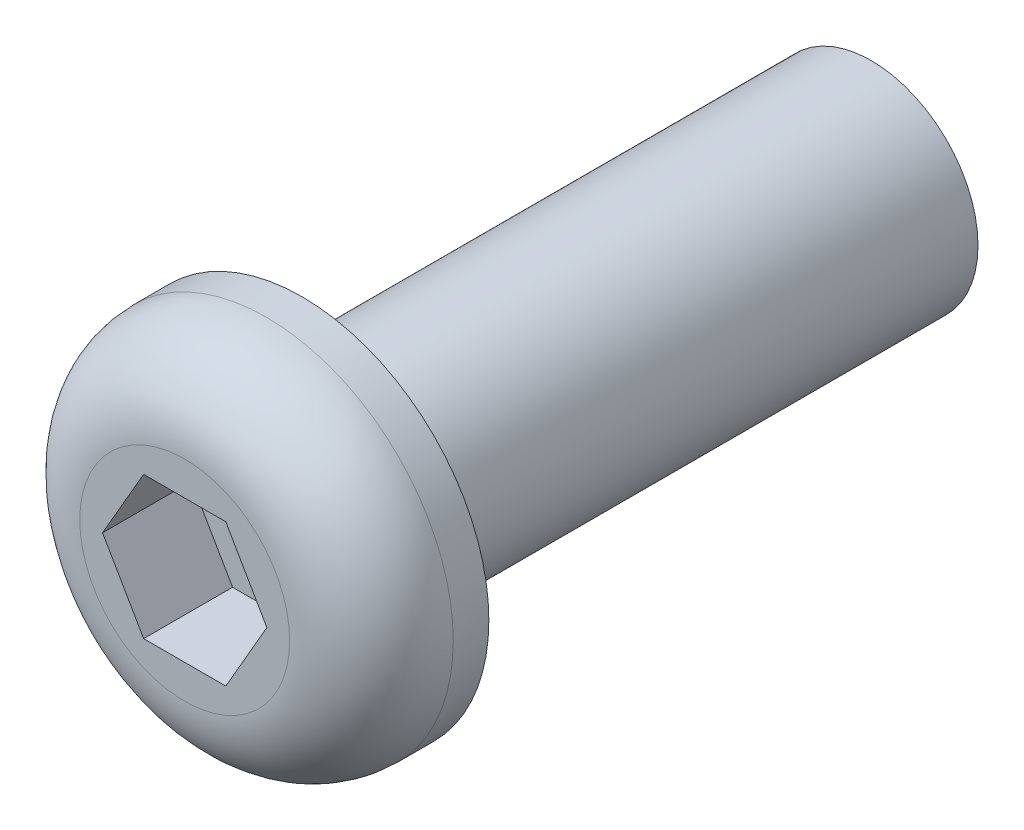
ISO-10303-21;
HEADER;
FILE_DESCRIPTION(('STEP AP214'),'2;1');
FILE_NAME('part.step','',(''),(''),'','','');
FILE_SCHEMA(('AUTOMOTIVE_DESIGN { 1 0 10303 214 1 1 1 1 }'));
ENDSEC;
DATA;
#1=APPLICATION_CONTEXT('core data for automotive mechanical design processes');
#2=APPLICATION_PROTOCOL_DEFINITION('international standard','automotive_design',2000,#1);
#3=PRODUCT_CONTEXT('',#1,'mechanical');
#4=PRODUCT('Part','Part','',(#3));
#5=PRODUCT_RELATED_PRODUCT_CATEGORY('part','',(#4));
#6=PRODUCT_DEFINITION_FORMATION('','',#4);
#7=PRODUCT_DEFINITION_CONTEXT('part definition',#1,'design');
#8=PRODUCT_DEFINITION('design','',#6,#7);
#9=PRODUCT_DEFINITION_SHAPE('','',#8);
#10=(LENGTH_UNIT() NAMED_UNIT(*) SI_UNIT(.MILLI.,.METRE.));
#11=(NAMED_UNIT(*) PLANE_ANGLE_UNIT() SI_UNIT($,.RADIAN.));
#12=(NAMED_UNIT(*) SI_UNIT($,.STERADIAN.) SOLID_ANGLE_UNIT());
#13=UNCERTAINTY_MEASURE_WITH_UNIT(LENGTH_MEASURE(1.E-05),#10,'distance_accuracy_value','');
#14=(GEOMETRIC_REPRESENTATION_CONTEXT(3) GLOBAL_UNCERTAINTY_ASSIGNED_CONTEXT((#13)) GLOBAL_UNIT_ASSIGNED_CONTEXT((#10,
#11,#12)) REPRESENTATION_CONTEXT('',''));
#15=CARTESIAN_POINT('',(0.,0.,0.));
#16=DIRECTION('',(0.,0.,1.));
#17=DIRECTION('',(1.,0.,0.));
#18=AXIS2_PLACEMENT_3D('',#15,#16,#17);
#19=CARTESIAN_POINT('',(0.,0.,-16.));
#20=DIRECTION('',(0.,0.,1.));
#21=DIRECTION('',(1.,0.,0.));
#22=AXIS2_PLACEMENT_3D('',#19,#20,#21);
#23=CYLINDRICAL_SURFACE('',#22,3.);
#24=CARTESIAN_POINT('',(0.,0.,-16.));
#25=DIRECTION('',(0.,0.,1.));
#26=DIRECTION('',(1.,0.,0.));
#27=AXIS2_PLACEMENT_3D('',#24,#25,#26);
#28=CIRCLE('',#27,3.);
#29=CARTESIAN_POINT('',(3.,0.,-16.));
#30=VERTEX_POINT('',#29);
#31=EDGE_CURVE('E11',#30,#30,#28,.T.);
#32=ORIENTED_EDGE('',*,*,#31,.T.);
#33=EDGE_LOOP('',(#32));
#34=FACE_BOUND('',#33,.T.);
#35=CARTESIAN_POINT('',(0.,0.,0.));
#36=DIRECTION('',(0.,0.,1.));
#37=DIRECTION('',(1.,0.,0.));
#38=AXIS2_PLACEMENT_3D('',#35,#36,#37);
#39=CIRCLE('',#38,3.);
#40=CARTESIAN_POINT('',(3.,0.,0.));
#41=VERTEX_POINT('',#40);
#42=EDGE_CURVE('E37',#41,#41,#39,.T.);
#43=ORIENTED_EDGE('',*,*,#42,.F.);
#44=EDGE_LOOP('',(#43));
#45=FACE_BOUND('',#44,.T.);
#46=ADVANCED_FACE('F34',(#34,#45),#23,.T.);
#47=CARTESIAN_POINT('',(0.,0.,-16.));
#48=DIRECTION('',(0.,0.,1.));
#49=DIRECTION('',(1.,0.,0.));
#50=AXIS2_PLACEMENT_3D('',#47,#48,#49);
#51=PLANE('',#50);
#52=ORIENTED_EDGE('',*,*,#31,.F.);
#53=EDGE_LOOP('',(#52));
#54=FACE_BOUND('',#53,.T.);
#55=ADVANCED_FACE('F157',(#54),#51,.F.);
#56=CARTESIAN_POINT('',(0.,0.,3.3));
#57=DIRECTION('',(0.,0.,1.));
#58=DIRECTION('',(1.,0.,0.));
#59=AXIS2_PLACEMENT_3D('',#56,#57,#58);
#60=PLANE('',#59);
#61=DIRECTION('',(-1.,0.,0.));
#62=VECTOR('',#61,1.);
#63=CARTESIAN_POINT('',(1.15470053837925,2.,3.3));
#64=LINE('',#63,#62);
#65=CARTESIAN_POINT('',(1.15470053837925,2.,3.3));
#66=VERTEX_POINT('',#65);
#67=CARTESIAN_POINT('',(-1.15470053837925,2.,3.3));
#68=VERTEX_POINT('',#67);
#69=EDGE_CURVE('E48',#66,#68,#64,.T.);
#70=ORIENTED_EDGE('',*,*,#69,.F.);
#71=DIRECTION('',(-0.5,0.866025403784439,0.));
#72=VECTOR('',#71,1.);
#73=CARTESIAN_POINT('',(2.3094010767585,0.,3.3));
#74=LINE('',#73,#72);
#75=CARTESIAN_POINT('',(2.3094010767585,0.,3.3));
#76=VERTEX_POINT('',#75);
#77=EDGE_CURVE('E131',#76,#66,#74,.T.);
#78=ORIENTED_EDGE('',*,*,#77,.F.);
#79=DIRECTION('',(0.5,0.866025403784439,0.));
#80=VECTOR('',#79,1.);
#81=CARTESIAN_POINT('',(1.15470053837925,-2.,3.3));
#82=LINE('',#81,#80);
#83=CARTESIAN_POINT('',(1.15470053837925,-2.,3.3));
#84=VERTEX_POINT('',#83);
#85=EDGE_CURVE('E129',#84,#76,#82,.T.);
#86=ORIENTED_EDGE('',*,*,#85,.F.);
#87=DIRECTION('',(1.,0.,0.));
#88=VECTOR('',#87,1.);
#89=CARTESIAN_POINT('',(-1.15470053837925,-2.,3.3));
#90=LINE('',#89,#88);
#91=CARTESIAN_POINT('',(-1.15470053837925,-2.,3.3));
#92=VERTEX_POINT('',#91);
#93=EDGE_CURVE('E96',#92,#84,#90,.T.);
#94=ORIENTED_EDGE('',*,*,#93,.F.);
#95=DIRECTION('',(0.5,-0.866025403784439,0.));
#96=VECTOR('',#95,1.);
#97=CARTESIAN_POINT('',(-2.3094010767585,0.,3.3));
#98=LINE('',#97,#96);
#99=CARTESIAN_POINT('',(-2.3094010767585,0.,3.3));
#100=VERTEX_POINT('',#99);
#101=EDGE_CURVE('E125',#100,#92,#98,.T.);
#102=ORIENTED_EDGE('',*,*,#101,.F.);
#103=DIRECTION('',(-0.5,-0.866025403784438,0.));
#104=VECTOR('',#103,1.);
#105=CARTESIAN_POINT('',(-1.15470053837925,2.,3.3));
#106=LINE('',#105,#104);
#107=EDGE_CURVE('E122',#68,#100,#106,.T.);
#108=ORIENTED_EDGE('',*,*,#107,.F.);
#109=EDGE_LOOP('',(#70,#78,#86,#94,#102,#108));
#110=FACE_BOUND('',#109,.T.);
#111=CARTESIAN_POINT('',(0.,0.,3.3));
#112=DIRECTION('',(0.,0.,-1.));
#113=DIRECTION('',(-1.,0.,0.));
#114=AXIS2_PLACEMENT_3D('',#111,#112,#113);
#115=CIRCLE('',#114,2.95);
#116=CARTESIAN_POINT('',(-2.95,0.,3.3));
#117=VERTEX_POINT('',#116);
#118=EDGE_CURVE('E146',#117,#117,#115,.T.);
#119=ORIENTED_EDGE('',*,*,#118,.F.);
#120=EDGE_LOOP('',(#119));
#121=FACE_BOUND('',#120,.T.);
#122=ADVANCED_FACE('F162',(#110,#121),#60,.T.);
#123=CARTESIAN_POINT('',(0.,0.,1.));
#124=DIRECTION('',(0.,0.,-1.));
#125=DIRECTION('',(-1.,0.,0.));
#126=AXIS2_PLACEMENT_3D('',#123,#124,#125);
#127=TOROIDAL_SURFACE('',#126,2.95,2.3);
#128=ORIENTED_EDGE('',*,*,#118,.T.);
#129=EDGE_LOOP('',(#128));
#130=FACE_BOUND('',#129,.T.);
#131=CARTESIAN_POINT('',(0.,0.,1.));
#132=DIRECTION('',(0.,0.,-1.));
#133=DIRECTION('',(-1.,0.,0.));
#134=AXIS2_PLACEMENT_3D('',#131,#132,#133);
#135=CIRCLE('',#134,5.25);
#136=CARTESIAN_POINT('',(-5.25,0.,1.));
#137=VERTEX_POINT('',#136);
#138=EDGE_CURVE('E143',#137,#137,#135,.T.);
#139=ORIENTED_EDGE('',*,*,#138,.F.);
#140=EDGE_LOOP('',(#139));
#141=FACE_BOUND('',#140,.T.);
#142=ADVANCED_FACE('F168',(#130,#141),#127,.T.);
#143=CARTESIAN_POINT('',(0.,0.,0.));
#144=DIRECTION('',(0.,0.,-1.));
#145=DIRECTION('',(-1.,0.,0.));
#146=AXIS2_PLACEMENT_3D('',#143,#144,#145);
#147=CYLINDRICAL_SURFACE('',#146,5.25);
#148=ORIENTED_EDGE('',*,*,#138,.T.);
#149=EDGE_LOOP('',(#148));
#150=FACE_BOUND('',#149,.T.);
#151=CARTESIAN_POINT('',(0.,0.,0.));
#152=DIRECTION('',(0.,0.,-1.));
#153=DIRECTION('',(-1.,0.,0.));
#154=AXIS2_PLACEMENT_3D('',#151,#152,#153);
#155=CIRCLE('',#154,5.25);
#156=CARTESIAN_POINT('',(-5.25,0.,0.));
#157=VERTEX_POINT('',#156);
#158=EDGE_CURVE('E135',#157,#157,#155,.T.);
#159=ORIENTED_EDGE('',*,*,#158,.F.);
#160=EDGE_LOOP('',(#159));
#161=FACE_BOUND('',#160,.T.);
#162=ADVANCED_FACE('F174',(#150,#161),#147,.T.);
#163=CARTESIAN_POINT('',(0.,0.,0.));
#164=DIRECTION('',(0.,0.,-1.));
#165=DIRECTION('',(-1.,0.,0.));
#166=AXIS2_PLACEMENT_3D('',#163,#164,#165);
#167=PLANE('',#166);
#168=ORIENTED_EDGE('',*,*,#42,.T.);
#169=EDGE_LOOP('',(#168));
#170=FACE_BOUND('',#169,.T.);
#171=ORIENTED_EDGE('',*,*,#158,.T.);
#172=EDGE_LOOP('',(#171));
#173=FACE_BOUND('',#172,.T.);
#174=ADVANCED_FACE('F153',(#170,#173),#167,.T.);
#175=CARTESIAN_POINT('',(1.15470053837925,2.,0.8));
#176=DIRECTION('',(0.,1.,0.));
#177=DIRECTION('',(0.,0.,1.));
#178=AXIS2_PLACEMENT_3D('',#175,#176,#177);
#179=PLANE('',#178);
#180=ORIENTED_EDGE('',*,*,#69,.T.);
#181=DIRECTION('',(0.,0.,1.));
#182=VECTOR('',#181,1.);
#183=CARTESIAN_POINT('',(-1.15470053837925,2.,0.8));
#184=LINE('',#183,#182);
#185=CARTESIAN_POINT('',(-1.15470053837925,2.,0.8));
#186=VERTEX_POINT('',#185);
#187=EDGE_CURVE('E78',#186,#68,#184,.T.);
#188=ORIENTED_EDGE('',*,*,#187,.F.);
#189=DIRECTION('',(-1.,0.,0.));
#190=VECTOR('',#189,1.);
#191=CARTESIAN_POINT('',(1.15470053837925,2.,0.8));
#192=LINE('',#191,#190);
#193=CARTESIAN_POINT('',(1.15470053837925,2.,0.8));
#194=VERTEX_POINT('',#193);
#195=EDGE_CURVE('E133',#194,#186,#192,.T.);
#196=ORIENTED_EDGE('',*,*,#195,.F.);
#197=DIRECTION('',(0.,0.,1.));
#198=VECTOR('',#197,1.);
#199=CARTESIAN_POINT('',(1.15470053837925,2.,0.8));
#200=LINE('',#199,#198);
#201=EDGE_CURVE('E56',#194,#66,#200,.T.);
#202=ORIENTED_EDGE('',*,*,#201,.T.);
#203=EDGE_LOOP('',(#180,#188,#196,#202));
#204=FACE_BOUND('',#203,.T.);
#205=ADVANCED_FACE('F180',(#204),#179,.F.);
#206=CARTESIAN_POINT('',(2.3094010767585,0.,0.8));
#207=DIRECTION('',(0.866025403784439,0.5,0.));
#208=DIRECTION('',(-0.5,0.866025403784439,0.));
#209=AXIS2_PLACEMENT_3D('',#206,#207,#208);
#210=PLANE('',#209);
#211=ORIENTED_EDGE('',*,*,#77,.T.);
#212=ORIENTED_EDGE('',*,*,#201,.F.);
#213=DIRECTION('',(-0.5,0.866025403784439,0.));
#214=VECTOR('',#213,1.);
#215=CARTESIAN_POINT('',(2.3094010767585,0.,0.8));
#216=LINE('',#215,#214);
#217=CARTESIAN_POINT('',(2.3094010767585,0.,0.8));
#218=VERTEX_POINT('',#217);
#219=EDGE_CURVE('E108',#218,#194,#216,.T.);
#220=ORIENTED_EDGE('',*,*,#219,.F.);
#221=DIRECTION('',(0.,0.,1.));
#222=VECTOR('',#221,1.);
#223=CARTESIAN_POINT('',(2.3094010767585,0.,0.8));
#224=LINE('',#223,#222);
#225=EDGE_CURVE('E100',#218,#76,#224,.T.);
#226=ORIENTED_EDGE('',*,*,#225,.T.);
#227=EDGE_LOOP('',(#211,#212,#220,#226));
#228=FACE_BOUND('',#227,.T.);
#229=ADVANCED_FACE('F183',(#228),#210,.F.);
#230=CARTESIAN_POINT('',(1.15470053837925,-2.,0.8));
#231=DIRECTION('',(0.866025403784439,-0.5,0.));
#232=DIRECTION('',(0.5,0.866025403784439,0.));
#233=AXIS2_PLACEMENT_3D('',#230,#231,#232);
#234=PLANE('',#233);
#235=ORIENTED_EDGE('',*,*,#85,.T.);
#236=ORIENTED_EDGE('',*,*,#225,.F.);
#237=DIRECTION('',(0.5,0.866025403784439,0.));
#238=VECTOR('',#237,1.);
#239=CARTESIAN_POINT('',(1.15470053837925,-2.,0.8));
#240=LINE('',#239,#238);
#241=CARTESIAN_POINT('',(1.15470053837925,-2.,0.8));
#242=VERTEX_POINT('',#241);
#243=EDGE_CURVE('E104',#242,#218,#240,.T.);
#244=ORIENTED_EDGE('',*,*,#243,.F.);
#245=DIRECTION('',(0.,0.,1.));
#246=VECTOR('',#245,1.);
#247=CARTESIAN_POINT('',(1.15470053837925,-2.,0.8));
#248=LINE('',#247,#246);
#249=EDGE_CURVE('E89',#242,#84,#248,.T.);
#250=ORIENTED_EDGE('',*,*,#249,.T.);
#251=EDGE_LOOP('',(#235,#236,#244,#250));
#252=FACE_BOUND('',#251,.T.);
#253=ADVANCED_FACE('F105',(#252),#234,.F.);
#254=CARTESIAN_POINT('',(-1.15470053837925,-2.,0.8));
#255=DIRECTION('',(0.,-1.,0.));
#256=DIRECTION('',(0.,0.,-1.));
#257=AXIS2_PLACEMENT_3D('',#254,#255,#256);
#258=PLANE('',#257);
#259=ORIENTED_EDGE('',*,*,#93,.T.);
#260=ORIENTED_EDGE('',*,*,#249,.F.);
#261=DIRECTION('',(1.,0.,0.));
#262=VECTOR('',#261,1.);
#263=CARTESIAN_POINT('',(-1.15470053837925,-2.,0.8));
#264=LINE('',#263,#262);
#265=CARTESIAN_POINT('',(-1.15470053837925,-2.,0.8));
#266=VERTEX_POINT('',#265);
#267=EDGE_CURVE('E93',#266,#242,#264,.T.);
#268=ORIENTED_EDGE('',*,*,#267,.F.);
#269=DIRECTION('',(0.,0.,1.));
#270=VECTOR('',#269,1.);
#271=CARTESIAN_POINT('',(-1.15470053837925,-2.,0.8));
#272=LINE('',#271,#270);
#273=EDGE_CURVE('E101',#266,#92,#272,.T.);
#274=ORIENTED_EDGE('',*,*,#273,.T.);
#275=EDGE_LOOP('',(#259,#260,#268,#274));
#276=FACE_BOUND('',#275,.T.);
#277=ADVANCED_FACE('F91',(#276),#258,.F.);
#278=CARTESIAN_POINT('',(-2.3094010767585,0.,0.8));
#279=DIRECTION('',(-0.866025403784439,-0.5,0.));
#280=DIRECTION('',(0.5,-0.866025403784439,0.));
#281=AXIS2_PLACEMENT_3D('',#278,#279,#280);
#282=PLANE('',#281);
#283=ORIENTED_EDGE('',*,*,#101,.T.);
#284=ORIENTED_EDGE('',*,*,#273,.F.);
#285=DIRECTION('',(0.5,-0.866025403784439,0.));
#286=VECTOR('',#285,1.);
#287=CARTESIAN_POINT('',(-2.3094010767585,0.,0.8));
#288=LINE('',#287,#286);
#289=CARTESIAN_POINT('',(-2.3094010767585,0.,0.8));
#290=VERTEX_POINT('',#289);
#291=EDGE_CURVE('E114',#290,#266,#288,.T.);
#292=ORIENTED_EDGE('',*,*,#291,.F.);
#293=DIRECTION('',(0.,0.,1.));
#294=VECTOR('',#293,1.);
#295=CARTESIAN_POINT('',(-2.3094010767585,0.,0.8));
#296=LINE('',#295,#294);
#297=EDGE_CURVE('E138',#290,#100,#296,.T.);
#298=ORIENTED_EDGE('',*,*,#297,.T.);
#299=EDGE_LOOP('',(#283,#284,#292,#298));
#300=FACE_BOUND('',#299,.T.);
#301=ADVANCED_FACE('F187',(#300),#282,.F.);
#302=CARTESIAN_POINT('',(-1.15470053837925,2.,0.8));
#303=DIRECTION('',(-0.866025403784439,0.5,0.));
#304=DIRECTION('',(-0.5,-0.866025403784439,0.));
#305=AXIS2_PLACEMENT_3D('',#302,#303,#304);
#306=PLANE('',#305);
#307=ORIENTED_EDGE('',*,*,#107,.T.);
#308=ORIENTED_EDGE('',*,*,#297,.F.);
#309=DIRECTION('',(-0.5,-0.866025403784438,0.));
#310=VECTOR('',#309,1.);
#311=CARTESIAN_POINT('',(-1.15470053837925,2.,0.8));
#312=LINE('',#311,#310);
#313=EDGE_CURVE('E116',#186,#290,#312,.T.);
#314=ORIENTED_EDGE('',*,*,#313,.F.);
#315=ORIENTED_EDGE('',*,*,#187,.T.);
#316=EDGE_LOOP('',(#307,#308,#314,#315));
#317=FACE_BOUND('',#316,.T.);
#318=ADVANCED_FACE('F184',(#317),#306,.F.);
#319=CARTESIAN_POINT('',(-3.46410161513775,2.,0.8));
#320=DIRECTION('',(0.,0.,1.));
#321=DIRECTION('',(1.,0.,0.));
#322=AXIS2_PLACEMENT_3D('',#319,#320,#321);
#323=PLANE('',#322);
#324=ORIENTED_EDGE('',*,*,#195,.T.);
#325=ORIENTED_EDGE('',*,*,#313,.T.);
#326=ORIENTED_EDGE('',*,*,#291,.T.);
#327=ORIENTED_EDGE('',*,*,#267,.T.);
#328=ORIENTED_EDGE('',*,*,#243,.T.);
#329=ORIENTED_EDGE('',*,*,#219,.T.);
#330=EDGE_LOOP('',(#324,#325,#326,#327,#328,#329));
#331=FACE_BOUND('',#330,.T.);
#332=ADVANCED_FACE('F111',(#331),#323,.T.);
#333=CLOSED_SHELL('',(#46,#55,#122,#142,#162,#174,#205,#229,#253,#277,#301,#318,#332));
#334=MANIFOLD_SOLID_BREP('B2',#333);
#335=ADVANCED_BREP_SHAPE_REPRESENTATION('',(#18,#334),#14);
#336=SHAPE_DEFINITION_REPRESENTATION(#9,#335);
ENDSEC;
END-ISO-10303-21;
